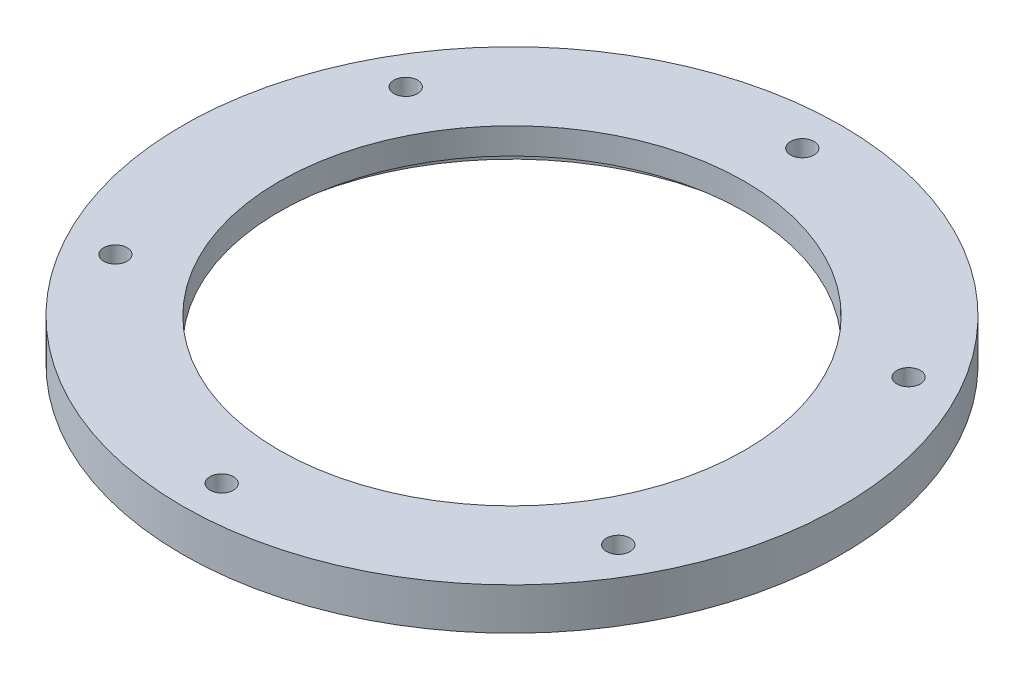
ISO-10303-21;
HEADER;
FILE_DESCRIPTION(('STEP AP214'),'2;1');
FILE_NAME('part.step','',(''),(''),'','','');
FILE_SCHEMA(('AUTOMOTIVE_DESIGN { 1 0 10303 214 1 1 1 1 }'));
ENDSEC;
DATA;
#1=APPLICATION_CONTEXT('core data for automotive mechanical design processes');
#2=APPLICATION_PROTOCOL_DEFINITION('international standard','automotive_design',2000,#1);
#3=PRODUCT_CONTEXT('',#1,'mechanical');
#4=PRODUCT('Part','Part','',(#3));
#5=PRODUCT_RELATED_PRODUCT_CATEGORY('part','',(#4));
#6=PRODUCT_DEFINITION_FORMATION('','',#4);
#7=PRODUCT_DEFINITION_CONTEXT('part definition',#1,'design');
#8=PRODUCT_DEFINITION('design','',#6,#7);
#9=PRODUCT_DEFINITION_SHAPE('','',#8);
#10=(LENGTH_UNIT() NAMED_UNIT(*) SI_UNIT(.MILLI.,.METRE.));
#11=(NAMED_UNIT(*) PLANE_ANGLE_UNIT() SI_UNIT($,.RADIAN.));
#12=(NAMED_UNIT(*) SI_UNIT($,.STERADIAN.) SOLID_ANGLE_UNIT());
#13=UNCERTAINTY_MEASURE_WITH_UNIT(LENGTH_MEASURE(1.E-05),#10,'distance_accuracy_value','');
#14=(GEOMETRIC_REPRESENTATION_CONTEXT(3) GLOBAL_UNCERTAINTY_ASSIGNED_CONTEXT((#13)) GLOBAL_UNIT_ASSIGNED_CONTEXT((#10,
#11,#12)) REPRESENTATION_CONTEXT('',''));
#15=CARTESIAN_POINT('',(0.,0.,0.));
#16=DIRECTION('',(0.,0.,1.));
#17=DIRECTION('',(1.,0.,0.));
#18=AXIS2_PLACEMENT_3D('',#15,#16,#17);
#19=CARTESIAN_POINT('',(0.,8.,0.));
#20=DIRECTION('',(0.,-1.,0.));
#21=DIRECTION('',(0.,0.,-1.));
#22=AXIS2_PLACEMENT_3D('',#19,#20,#21);
#23=CYLINDRICAL_SURFACE('',#22,44.5);
#24=CARTESIAN_POINT('',(0.,8.,0.));
#25=DIRECTION('',(0.,1.,0.));
#26=DIRECTION('',(0.,0.,1.));
#27=AXIS2_PLACEMENT_3D('',#24,#25,#26);
#28=CIRCLE('',#27,44.5);
#29=CARTESIAN_POINT('',(0.,8.,44.5));
#30=VERTEX_POINT('',#29);
#31=EDGE_CURVE('E46',#30,#30,#28,.T.);
#32=ORIENTED_EDGE('',*,*,#31,.T.);
#33=EDGE_LOOP('',(#32));
#34=FACE_BOUND('',#33,.T.);
#35=CARTESIAN_POINT('',(0.,3.,0.));
#36=DIRECTION('',(0.,-1.,0.));
#37=DIRECTION('',(0.,0.,-1.));
#38=AXIS2_PLACEMENT_3D('',#35,#36,#37);
#39=CIRCLE('',#38,44.5);
#40=CARTESIAN_POINT('',(0.,3.,-44.5));
#41=VERTEX_POINT('',#40);
#42=EDGE_CURVE('E37',#41,#41,#39,.T.);
#43=ORIENTED_EDGE('',*,*,#42,.T.);
#44=EDGE_LOOP('',(#43));
#45=FACE_BOUND('',#44,.T.);
#46=ADVANCED_FACE('F33',(#34,#45),#23,.F.);
#47=CARTESIAN_POINT('',(0.,8.,0.));
#48=DIRECTION('',(0.,1.,0.));
#49=DIRECTION('',(0.,0.,1.));
#50=AXIS2_PLACEMENT_3D('',#47,#48,#49);
#51=PLANE('',#50);
#52=CARTESIAN_POINT('',(-48.0644099100321,8.,27.7500000000025));
#53=DIRECTION('',(0.,1.,0.));
#54=DIRECTION('',(0.,0.,1.));
#55=AXIS2_PLACEMENT_3D('',#52,#53,#54);
#56=CIRCLE('',#55,2.25);
#57=CARTESIAN_POINT('',(-48.0644099100321,8.,30.0000000000025));
#58=VERTEX_POINT('',#57);
#59=EDGE_CURVE('E72',#58,#58,#56,.T.);
#60=ORIENTED_EDGE('',*,*,#59,.F.);
#61=EDGE_LOOP('',(#60));
#62=FACE_BOUND('',#61,.T.);
#63=CARTESIAN_POINT('',(48.0644099100407,8.,27.7499999999975));
#64=DIRECTION('',(0.,1.,0.));
#65=DIRECTION('',(0.,0.,1.));
#66=AXIS2_PLACEMENT_3D('',#63,#64,#65);
#67=CIRCLE('',#66,2.25);
#68=CARTESIAN_POINT('',(48.0644099100407,8.,29.9999999999975));
#69=VERTEX_POINT('',#68);
#70=EDGE_CURVE('E60',#69,#69,#67,.T.);
#71=ORIENTED_EDGE('',*,*,#70,.F.);
#72=EDGE_LOOP('',(#71));
#73=FACE_BOUND('',#72,.T.);
#74=CARTESIAN_POINT('',(0.,8.,-55.5));
#75=DIRECTION('',(0.,1.,0.));
#76=DIRECTION('',(0.,0.,1.));
#77=AXIS2_PLACEMENT_3D('',#74,#75,#76);
#78=CIRCLE('',#77,2.25);
#79=CARTESIAN_POINT('',(0.,8.,-53.25));
#80=VERTEX_POINT('',#79);
#81=EDGE_CURVE('E50',#80,#80,#78,.T.);
#82=ORIENTED_EDGE('',*,*,#81,.F.);
#83=EDGE_LOOP('',(#82));
#84=FACE_BOUND('',#83,.T.);
#85=CARTESIAN_POINT('',(0.,8.,0.));
#86=DIRECTION('',(0.,1.,0.));
#87=DIRECTION('',(0.,0.,1.));
#88=AXIS2_PLACEMENT_3D('',#85,#86,#87);
#89=CIRCLE('',#88,63.);
#90=CARTESIAN_POINT('',(0.,8.,63.));
#91=VERTEX_POINT('',#90);
#92=EDGE_CURVE('E10',#91,#91,#89,.T.);
#93=ORIENTED_EDGE('',*,*,#92,.T.);
#94=EDGE_LOOP('',(#93));
#95=FACE_BOUND('',#94,.T.);
#96=ORIENTED_EDGE('',*,*,#31,.F.);
#97=EDGE_LOOP('',(#96));
#98=FACE_BOUND('',#97,.T.);
#99=CARTESIAN_POINT('',(48.0644099100378,8.,-27.7500000000025));
#100=DIRECTION('',(0.,1.,0.));
#101=DIRECTION('',(0.,0.,1.));
#102=AXIS2_PLACEMENT_3D('',#99,#100,#101);
#103=CIRCLE('',#102,2.25);
#104=CARTESIAN_POINT('',(48.0644099100378,8.,-25.5000000000025));
#105=VERTEX_POINT('',#104);
#106=EDGE_CURVE('E54',#105,#105,#103,.T.);
#107=ORIENTED_EDGE('',*,*,#106,.F.);
#108=EDGE_LOOP('',(#107));
#109=FACE_BOUND('',#108,.T.);
#110=CARTESIAN_POINT('',(5.7291274858151E-12,8.,55.5));
#111=DIRECTION('',(0.,1.,0.));
#112=DIRECTION('',(0.,0.,1.));
#113=AXIS2_PLACEMENT_3D('',#110,#111,#112);
#114=CIRCLE('',#113,2.25);
#115=CARTESIAN_POINT('',(5.7291274858151E-12,8.,57.75));
#116=VERTEX_POINT('',#115);
#117=EDGE_CURVE('E66',#116,#116,#114,.T.);
#118=ORIENTED_EDGE('',*,*,#117,.F.);
#119=EDGE_LOOP('',(#118));
#120=FACE_BOUND('',#119,.T.);
#121=CARTESIAN_POINT('',(-48.0644099100349,8.,-27.7499999999975));
#122=DIRECTION('',(0.,1.,0.));
#123=DIRECTION('',(0.,0.,1.));
#124=AXIS2_PLACEMENT_3D('',#121,#122,#123);
#125=CIRCLE('',#124,2.25);
#126=CARTESIAN_POINT('',(-48.0644099100349,8.,-25.4999999999975));
#127=VERTEX_POINT('',#126);
#128=EDGE_CURVE('E78',#127,#127,#125,.T.);
#129=ORIENTED_EDGE('',*,*,#128,.F.);
#130=EDGE_LOOP('',(#129));
#131=FACE_BOUND('',#130,.T.);
#132=ADVANCED_FACE('F108',(#62,#73,#84,#95,#98,#109,#120,#131),#51,.T.);
#133=CARTESIAN_POINT('',(0.,0.,0.));
#134=DIRECTION('',(0.,1.,0.));
#135=DIRECTION('',(0.,0.,1.));
#136=AXIS2_PLACEMENT_3D('',#133,#134,#135);
#137=PLANE('',#136);
#138=CARTESIAN_POINT('',(0.,0.,0.));
#139=DIRECTION('',(0.,-1.,0.));
#140=DIRECTION('',(0.,0.,-1.));
#141=AXIS2_PLACEMENT_3D('',#138,#139,#140);
#142=CIRCLE('',#141,48.);
#143=CARTESIAN_POINT('',(0.,0.,-48.));
#144=VERTEX_POINT('',#143);
#145=EDGE_CURVE('E86',#144,#144,#142,.T.);
#146=ORIENTED_EDGE('',*,*,#145,.F.);
#147=EDGE_LOOP('',(#146));
#148=FACE_BOUND('',#147,.T.);
#149=CARTESIAN_POINT('',(0.,0.,0.));
#150=DIRECTION('',(0.,1.,0.));
#151=DIRECTION('',(0.,0.,1.));
#152=AXIS2_PLACEMENT_3D('',#149,#150,#151);
#153=CIRCLE('',#152,63.);
#154=CARTESIAN_POINT('',(0.,0.,63.));
#155=VERTEX_POINT('',#154);
#156=EDGE_CURVE('E41',#155,#155,#153,.T.);
#157=ORIENTED_EDGE('',*,*,#156,.F.);
#158=EDGE_LOOP('',(#157));
#159=FACE_BOUND('',#158,.T.);
#160=CARTESIAN_POINT('',(0.,0.,-55.5));
#161=DIRECTION('',(0.,1.,0.));
#162=DIRECTION('',(0.,0.,1.));
#163=AXIS2_PLACEMENT_3D('',#160,#161,#162);
#164=CIRCLE('',#163,2.25);
#165=CARTESIAN_POINT('',(0.,0.,-53.25));
#166=VERTEX_POINT('',#165);
#167=EDGE_CURVE('E51',#166,#166,#164,.T.);
#168=ORIENTED_EDGE('',*,*,#167,.T.);
#169=EDGE_LOOP('',(#168));
#170=FACE_BOUND('',#169,.T.);
#171=CARTESIAN_POINT('',(48.0644099100378,0.,-27.7500000000025));
#172=DIRECTION('',(0.,1.,0.));
#173=DIRECTION('',(0.,0.,1.));
#174=AXIS2_PLACEMENT_3D('',#171,#172,#173);
#175=CIRCLE('',#174,2.25);
#176=CARTESIAN_POINT('',(48.0644099100378,0.,-25.5000000000025));
#177=VERTEX_POINT('',#176);
#178=EDGE_CURVE('E57',#177,#177,#175,.T.);
#179=ORIENTED_EDGE('',*,*,#178,.T.);
#180=EDGE_LOOP('',(#179));
#181=FACE_BOUND('',#180,.T.);
#182=CARTESIAN_POINT('',(48.0644099100407,0.,27.7499999999975));
#183=DIRECTION('',(0.,1.,0.));
#184=DIRECTION('',(0.,0.,1.));
#185=AXIS2_PLACEMENT_3D('',#182,#183,#184);
#186=CIRCLE('',#185,2.25);
#187=CARTESIAN_POINT('',(48.0644099100407,0.,29.9999999999975));
#188=VERTEX_POINT('',#187);
#189=EDGE_CURVE('E63',#188,#188,#186,.T.);
#190=ORIENTED_EDGE('',*,*,#189,.T.);
#191=EDGE_LOOP('',(#190));
#192=FACE_BOUND('',#191,.T.);
#193=CARTESIAN_POINT('',(5.7291274858151E-12,0.,55.5));
#194=DIRECTION('',(0.,1.,0.));
#195=DIRECTION('',(0.,0.,1.));
#196=AXIS2_PLACEMENT_3D('',#193,#194,#195);
#197=CIRCLE('',#196,2.25);
#198=CARTESIAN_POINT('',(5.7291274858151E-12,0.,57.75));
#199=VERTEX_POINT('',#198);
#200=EDGE_CURVE('E69',#199,#199,#197,.T.);
#201=ORIENTED_EDGE('',*,*,#200,.T.);
#202=EDGE_LOOP('',(#201));
#203=FACE_BOUND('',#202,.T.);
#204=CARTESIAN_POINT('',(-48.0644099100321,0.,27.7500000000025));
#205=DIRECTION('',(0.,1.,0.));
#206=DIRECTION('',(0.,0.,1.));
#207=AXIS2_PLACEMENT_3D('',#204,#205,#206);
#208=CIRCLE('',#207,2.25);
#209=CARTESIAN_POINT('',(-48.0644099100321,0.,30.0000000000025));
#210=VERTEX_POINT('',#209);
#211=EDGE_CURVE('E75',#210,#210,#208,.T.);
#212=ORIENTED_EDGE('',*,*,#211,.T.);
#213=EDGE_LOOP('',(#212));
#214=FACE_BOUND('',#213,.T.);
#215=CARTESIAN_POINT('',(-48.0644099100349,0.,-27.7499999999975));
#216=DIRECTION('',(0.,1.,0.));
#217=DIRECTION('',(0.,0.,1.));
#218=AXIS2_PLACEMENT_3D('',#215,#216,#217);
#219=CIRCLE('',#218,2.25);
#220=CARTESIAN_POINT('',(-48.0644099100349,0.,-25.4999999999975));
#221=VERTEX_POINT('',#220);
#222=EDGE_CURVE('E81',#221,#221,#219,.T.);
#223=ORIENTED_EDGE('',*,*,#222,.T.);
#224=EDGE_LOOP('',(#223));
#225=FACE_BOUND('',#224,.T.);
#226=ADVANCED_FACE('F114',(#148,#159,#170,#181,#192,#203,#214,#225),#137,.F.);
#227=CARTESIAN_POINT('',(0.,8.,0.));
#228=DIRECTION('',(0.,-1.,0.));
#229=DIRECTION('',(0.,0.,-1.));
#230=AXIS2_PLACEMENT_3D('',#227,#228,#229);
#231=CYLINDRICAL_SURFACE('',#230,63.);
#232=ORIENTED_EDGE('',*,*,#92,.F.);
#233=EDGE_LOOP('',(#232));
#234=FACE_BOUND('',#233,.T.);
#235=ORIENTED_EDGE('',*,*,#156,.T.);
#236=EDGE_LOOP('',(#235));
#237=FACE_BOUND('',#236,.T.);
#238=ADVANCED_FACE('F35',(#234,#237),#231,.T.);
#239=CARTESIAN_POINT('',(0.,8.,-55.5));
#240=DIRECTION('',(0.,-1.,0.));
#241=DIRECTION('',(0.,0.,-1.));
#242=AXIS2_PLACEMENT_3D('',#239,#240,#241);
#243=CYLINDRICAL_SURFACE('',#242,2.25);
#244=ORIENTED_EDGE('',*,*,#81,.T.);
#245=EDGE_LOOP('',(#244));
#246=FACE_BOUND('',#245,.T.);
#247=ORIENTED_EDGE('',*,*,#167,.F.);
#248=EDGE_LOOP('',(#247));
#249=FACE_BOUND('',#248,.T.);
#250=ADVANCED_FACE('F118',(#246,#249),#243,.F.);
#251=CARTESIAN_POINT('',(48.0644099100378,8.,-27.7500000000025));
#252=DIRECTION('',(0.,-1.,0.));
#253=DIRECTION('',(0.,0.,-1.));
#254=AXIS2_PLACEMENT_3D('',#251,#252,#253);
#255=CYLINDRICAL_SURFACE('',#254,2.25);
#256=ORIENTED_EDGE('',*,*,#106,.T.);
#257=EDGE_LOOP('',(#256));
#258=FACE_BOUND('',#257,.T.);
#259=ORIENTED_EDGE('',*,*,#178,.F.);
#260=EDGE_LOOP('',(#259));
#261=FACE_BOUND('',#260,.T.);
#262=ADVANCED_FACE('F158',(#258,#261),#255,.F.);
#263=CARTESIAN_POINT('',(48.0644099100407,8.,27.7499999999975));
#264=DIRECTION('',(0.,-1.,0.));
#265=DIRECTION('',(0.,0.,-1.));
#266=AXIS2_PLACEMENT_3D('',#263,#264,#265);
#267=CYLINDRICAL_SURFACE('',#266,2.25);
#268=ORIENTED_EDGE('',*,*,#70,.T.);
#269=EDGE_LOOP('',(#268));
#270=FACE_BOUND('',#269,.T.);
#271=ORIENTED_EDGE('',*,*,#189,.F.);
#272=EDGE_LOOP('',(#271));
#273=FACE_BOUND('',#272,.T.);
#274=ADVANCED_FACE('F155',(#270,#273),#267,.F.);
#275=CARTESIAN_POINT('',(5.7291274858151E-12,8.,55.5));
#276=DIRECTION('',(0.,-1.,0.));
#277=DIRECTION('',(0.,0.,-1.));
#278=AXIS2_PLACEMENT_3D('',#275,#276,#277);
#279=CYLINDRICAL_SURFACE('',#278,2.25);
#280=ORIENTED_EDGE('',*,*,#117,.T.);
#281=EDGE_LOOP('',(#280));
#282=FACE_BOUND('',#281,.T.);
#283=ORIENTED_EDGE('',*,*,#200,.F.);
#284=EDGE_LOOP('',(#283));
#285=FACE_BOUND('',#284,.T.);
#286=ADVANCED_FACE('F149',(#282,#285),#279,.F.);
#287=CARTESIAN_POINT('',(-48.0644099100321,8.,27.7500000000025));
#288=DIRECTION('',(0.,-1.,0.));
#289=DIRECTION('',(0.,0.,-1.));
#290=AXIS2_PLACEMENT_3D('',#287,#288,#289);
#291=CYLINDRICAL_SURFACE('',#290,2.25);
#292=ORIENTED_EDGE('',*,*,#59,.T.);
#293=EDGE_LOOP('',(#292));
#294=FACE_BOUND('',#293,.T.);
#295=ORIENTED_EDGE('',*,*,#211,.F.);
#296=EDGE_LOOP('',(#295));
#297=FACE_BOUND('',#296,.T.);
#298=ADVANCED_FACE('F143',(#294,#297),#291,.F.);
#299=CARTESIAN_POINT('',(-48.0644099100349,8.,-27.7499999999975));
#300=DIRECTION('',(0.,-1.,0.));
#301=DIRECTION('',(0.,0.,-1.));
#302=AXIS2_PLACEMENT_3D('',#299,#300,#301);
#303=CYLINDRICAL_SURFACE('',#302,2.25);
#304=ORIENTED_EDGE('',*,*,#128,.T.);
#305=EDGE_LOOP('',(#304));
#306=FACE_BOUND('',#305,.T.);
#307=ORIENTED_EDGE('',*,*,#222,.F.);
#308=EDGE_LOOP('',(#307));
#309=FACE_BOUND('',#308,.T.);
#310=ADVANCED_FACE('F104',(#306,#309),#303,.F.);
#311=CARTESIAN_POINT('',(0.,3.,0.));
#312=DIRECTION('',(0.,-1.,0.));
#313=DIRECTION('',(0.,0.,-1.));
#314=AXIS2_PLACEMENT_3D('',#311,#312,#313);
#315=CYLINDRICAL_SURFACE('',#314,48.);
#316=CARTESIAN_POINT('',(0.,3.,0.));
#317=DIRECTION('',(0.,-1.,0.));
#318=DIRECTION('',(0.,0.,-1.));
#319=AXIS2_PLACEMENT_3D('',#316,#317,#318);
#320=CIRCLE('',#319,48.);
#321=CARTESIAN_POINT('',(0.,3.,-48.));
#322=VERTEX_POINT('',#321);
#323=EDGE_CURVE('E89',#322,#322,#320,.T.);
#324=ORIENTED_EDGE('',*,*,#323,.F.);
#325=EDGE_LOOP('',(#324));
#326=FACE_BOUND('',#325,.T.);
#327=ORIENTED_EDGE('',*,*,#145,.T.);
#328=EDGE_LOOP('',(#327));
#329=FACE_BOUND('',#328,.T.);
#330=ADVANCED_FACE('F99',(#326,#329),#315,.F.);
#331=CARTESIAN_POINT('',(0.,3.,0.));
#332=DIRECTION('',(0.,-1.,0.));
#333=DIRECTION('',(0.,0.,-1.));
#334=AXIS2_PLACEMENT_3D('',#331,#332,#333);
#335=PLANE('',#334);
#336=ORIENTED_EDGE('',*,*,#42,.F.);
#337=EDGE_LOOP('',(#336));
#338=FACE_BOUND('',#337,.T.);
#339=ORIENTED_EDGE('',*,*,#323,.T.);
#340=EDGE_LOOP('',(#339));
#341=FACE_BOUND('',#340,.T.);
#342=ADVANCED_FACE('F97',(#338,#341),#335,.T.);
#343=CLOSED_SHELL('',(#46,#132,#226,#238,#250,#262,#274,#286,#298,#310,#330,#342));
#344=MANIFOLD_SOLID_BREP('B2',#343);
#345=ADVANCED_BREP_SHAPE_REPRESENTATION('',(#18,#344),#14);
#346=SHAPE_DEFINITION_REPRESENTATION(#9,#345);
ENDSEC;
END-ISO-10303-21;
